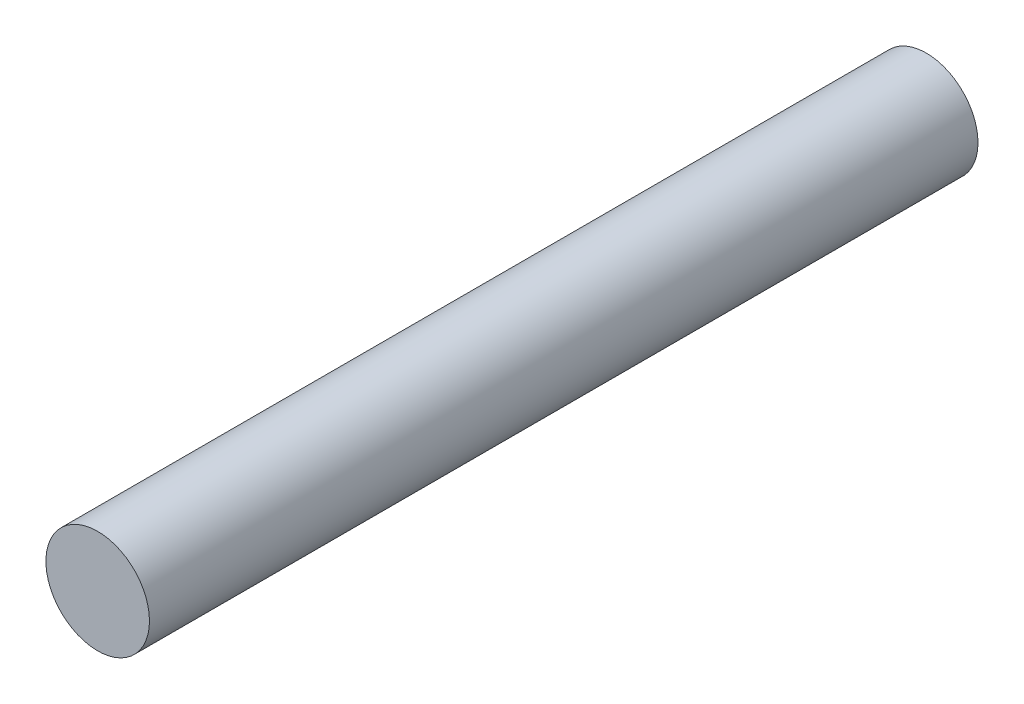
ISO-10303-21;
HEADER;
FILE_DESCRIPTION(('STEP AP214'),'2;1');
FILE_NAME('part.step','',(''),(''),'','','');
FILE_SCHEMA(('AUTOMOTIVE_DESIGN { 1 0 10303 214 1 1 1 1 }'));
ENDSEC;
DATA;
#1=APPLICATION_CONTEXT('core data for automotive mechanical design processes');
#2=APPLICATION_PROTOCOL_DEFINITION('international standard','automotive_design',2000,#1);
#3=PRODUCT_CONTEXT('',#1,'mechanical');
#4=PRODUCT('Part','Part','',(#3));
#5=PRODUCT_RELATED_PRODUCT_CATEGORY('part','',(#4));
#6=PRODUCT_DEFINITION_FORMATION('','',#4);
#7=PRODUCT_DEFINITION_CONTEXT('part definition',#1,'design');
#8=PRODUCT_DEFINITION('design','',#6,#7);
#9=PRODUCT_DEFINITION_SHAPE('','',#8);
#10=(LENGTH_UNIT() NAMED_UNIT(*) SI_UNIT(.MILLI.,.METRE.));
#11=(NAMED_UNIT(*) PLANE_ANGLE_UNIT() SI_UNIT($,.RADIAN.));
#12=(NAMED_UNIT(*) SI_UNIT($,.STERADIAN.) SOLID_ANGLE_UNIT());
#13=UNCERTAINTY_MEASURE_WITH_UNIT(LENGTH_MEASURE(1.E-05),#10,'distance_accuracy_value','');
#14=(GEOMETRIC_REPRESENTATION_CONTEXT(3) GLOBAL_UNCERTAINTY_ASSIGNED_CONTEXT((#13)) GLOBAL_UNIT_ASSIGNED_CONTEXT((#10,
#11,#12)) REPRESENTATION_CONTEXT('',''));
#15=CARTESIAN_POINT('',(0.,0.,0.));
#16=DIRECTION('',(0.,0.,1.));
#17=DIRECTION('',(1.,0.,0.));
#18=AXIS2_PLACEMENT_3D('',#15,#16,#17);
#19=CARTESIAN_POINT('',(0.,0.,40.));
#20=DIRECTION('',(0.,0.,-1.));
#21=DIRECTION('',(-1.,0.,0.));
#22=AXIS2_PLACEMENT_3D('',#19,#20,#21);
#23=CYLINDRICAL_SURFACE('',#22,2.5);
#24=CARTESIAN_POINT('',(0.,0.,40.));
#25=DIRECTION('',(0.,0.,1.));
#26=DIRECTION('',(1.,0.,0.));
#27=AXIS2_PLACEMENT_3D('',#24,#25,#26);
#28=CIRCLE('',#27,2.5);
#29=CARTESIAN_POINT('',(2.5,0.,40.));
#30=VERTEX_POINT('',#29);
#31=EDGE_CURVE('E10',#30,#30,#28,.T.);
#32=ORIENTED_EDGE('',*,*,#31,.F.);
#33=EDGE_LOOP('',(#32));
#34=FACE_BOUND('',#33,.T.);
#35=CARTESIAN_POINT('',(0.,0.,0.));
#36=DIRECTION('',(0.,0.,1.));
#37=DIRECTION('',(1.,0.,0.));
#38=AXIS2_PLACEMENT_3D('',#35,#36,#37);
#39=CIRCLE('',#38,2.5);
#40=CARTESIAN_POINT('',(2.5,0.,0.));
#41=VERTEX_POINT('',#40);
#42=EDGE_CURVE('E33',#41,#41,#39,.T.);
#43=ORIENTED_EDGE('',*,*,#42,.T.);
#44=EDGE_LOOP('',(#43));
#45=FACE_BOUND('',#44,.T.);
#46=ADVANCED_FACE('F30',(#34,#45),#23,.T.);
#47=CARTESIAN_POINT('',(0.,0.,40.));
#48=DIRECTION('',(0.,0.,1.));
#49=DIRECTION('',(1.,0.,0.));
#50=AXIS2_PLACEMENT_3D('',#47,#48,#49);
#51=PLANE('',#50);
#52=ORIENTED_EDGE('',*,*,#31,.T.);
#53=EDGE_LOOP('',(#52));
#54=FACE_BOUND('',#53,.T.);
#55=ADVANCED_FACE('F45',(#54),#51,.T.);
#56=CARTESIAN_POINT('',(0.,0.,0.));
#57=DIRECTION('',(0.,0.,1.));
#58=DIRECTION('',(1.,0.,0.));
#59=AXIS2_PLACEMENT_3D('',#56,#57,#58);
#60=PLANE('',#59);
#61=ORIENTED_EDGE('',*,*,#42,.F.);
#62=EDGE_LOOP('',(#61));
#63=FACE_BOUND('',#62,.T.);
#64=ADVANCED_FACE('F43',(#63),#60,.F.);
#65=CLOSED_SHELL('',(#46,#55,#64));
#66=MANIFOLD_SOLID_BREP('B2',#65);
#67=ADVANCED_BREP_SHAPE_REPRESENTATION('',(#18,#66),#14);
#68=SHAPE_DEFINITION_REPRESENTATION(#9,#67);
ENDSEC;
END-ISO-10303-21;
